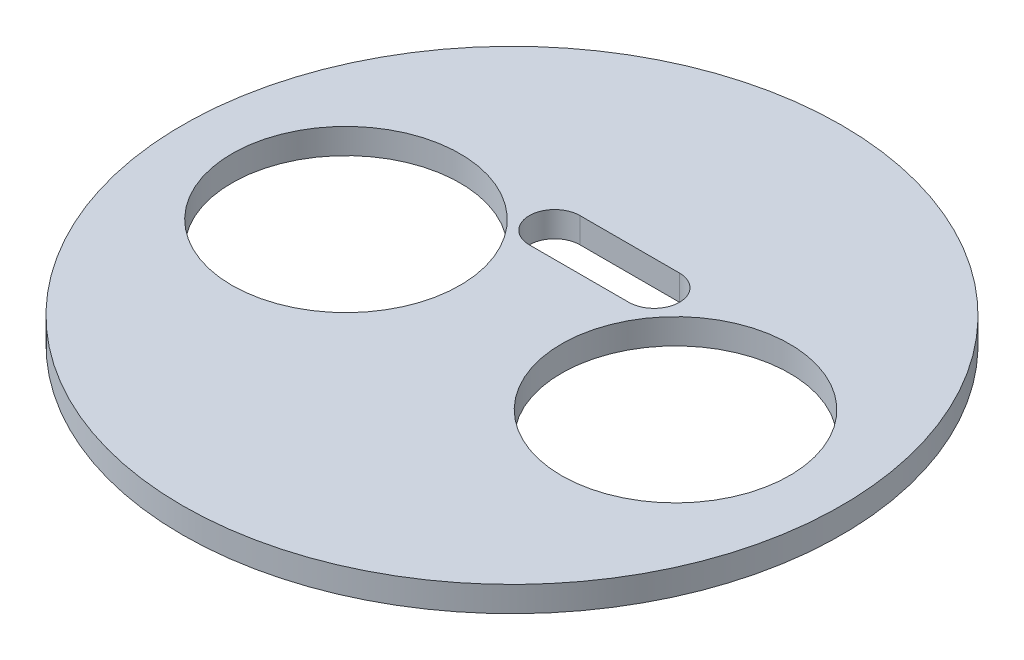
ISO-10303-21;
HEADER;
FILE_DESCRIPTION(('STEP AP214'),'2;1');
FILE_NAME('part.step','',(''),(''),'','','');
FILE_SCHEMA(('AUTOMOTIVE_DESIGN { 1 0 10303 214 1 1 1 1 }'));
ENDSEC;
DATA;
#1=APPLICATION_CONTEXT('core data for automotive mechanical design processes');
#2=APPLICATION_PROTOCOL_DEFINITION('international standard','automotive_design',2000,#1);
#3=PRODUCT_CONTEXT('',#1,'mechanical');
#4=PRODUCT('Part','Part','',(#3));
#5=PRODUCT_RELATED_PRODUCT_CATEGORY('part','',(#4));
#6=PRODUCT_DEFINITION_FORMATION('','',#4);
#7=PRODUCT_DEFINITION_CONTEXT('part definition',#1,'design');
#8=PRODUCT_DEFINITION('design','',#6,#7);
#9=PRODUCT_DEFINITION_SHAPE('','',#8);
#10=(LENGTH_UNIT() NAMED_UNIT(*) SI_UNIT(.MILLI.,.METRE.));
#11=(NAMED_UNIT(*) PLANE_ANGLE_UNIT() SI_UNIT($,.RADIAN.));
#12=(NAMED_UNIT(*) SI_UNIT($,.STERADIAN.) SOLID_ANGLE_UNIT());
#13=UNCERTAINTY_MEASURE_WITH_UNIT(LENGTH_MEASURE(1.E-05),#10,'distance_accuracy_value','');
#14=(GEOMETRIC_REPRESENTATION_CONTEXT(3) GLOBAL_UNCERTAINTY_ASSIGNED_CONTEXT((#13)) GLOBAL_UNIT_ASSIGNED_CONTEXT((#10,
#11,#12)) REPRESENTATION_CONTEXT('',''));
#15=CARTESIAN_POINT('',(0.,0.,0.));
#16=DIRECTION('',(0.,0.,1.));
#17=DIRECTION('',(1.,0.,0.));
#18=AXIS2_PLACEMENT_3D('',#15,#16,#17);
#19=CARTESIAN_POINT('',(3.37106083902436,2.,-8.31125845977741));
#20=DIRECTION('',(0.,-1.,0.));
#21=DIRECTION('',(0.,0.,-1.));
#22=AXIS2_PLACEMENT_3D('',#19,#20,#21);
#23=CYLINDRICAL_SURFACE('',#22,2.);
#24=CARTESIAN_POINT('',(3.37106083902436,0.,-8.31125845977741));
#25=DIRECTION('',(0.,1.,0.));
#26=DIRECTION('',(0.,0.,1.));
#27=AXIS2_PLACEMENT_3D('',#24,#25,#26);
#28=CIRCLE('',#27,2.);
#29=CARTESIAN_POINT('',(3.37106083902436,0.,-6.3112584597774));
#30=VERTEX_POINT('',#29);
#31=CARTESIAN_POINT('',(3.37106083902436,0.,-10.3112584597774));
#32=VERTEX_POINT('',#31);
#33=EDGE_CURVE('E127',#30,#32,#28,.T.);
#34=ORIENTED_EDGE('',*,*,#33,.F.);
#35=DIRECTION('',(0.,-1.,0.));
#36=VECTOR('',#35,1.);
#37=CARTESIAN_POINT('',(3.37106083902436,2.,-6.3112584597774));
#38=LINE('',#37,#36);
#39=CARTESIAN_POINT('',(3.37106083902436,2.,-6.3112584597774));
#40=VERTEX_POINT('',#39);
#41=EDGE_CURVE('E11',#40,#30,#38,.T.);
#42=ORIENTED_EDGE('',*,*,#41,.F.);
#43=CARTESIAN_POINT('',(3.37106083902436,2.,-8.31125845977741));
#44=DIRECTION('',(0.,1.,0.));
#45=DIRECTION('',(0.,0.,1.));
#46=AXIS2_PLACEMENT_3D('',#43,#44,#45);
#47=CIRCLE('',#46,2.);
#48=CARTESIAN_POINT('',(3.37106083902436,2.,-10.3112584597774));
#49=VERTEX_POINT('',#48);
#50=EDGE_CURVE('E105',#40,#49,#47,.T.);
#51=ORIENTED_EDGE('',*,*,#50,.T.);
#52=DIRECTION('',(0.,-1.,0.));
#53=VECTOR('',#52,1.);
#54=CARTESIAN_POINT('',(3.37106083902436,2.,-10.3112584597774));
#55=LINE('',#54,#53);
#56=EDGE_CURVE('E85',#49,#32,#55,.T.);
#57=ORIENTED_EDGE('',*,*,#56,.T.);
#58=EDGE_LOOP('',(#34,#42,#51,#57));
#59=FACE_BOUND('',#58,.T.);
#60=ADVANCED_FACE('F46',(#59),#23,.F.);
#61=CARTESIAN_POINT('',(0.,2.,-6.3112584597774));
#62=DIRECTION('',(0.,0.,-1.));
#63=DIRECTION('',(-1.,0.,0.));
#64=AXIS2_PLACEMENT_3D('',#61,#62,#63);
#65=PLANE('',#64);
#66=DIRECTION('',(1.,0.,0.));
#67=VECTOR('',#66,1.);
#68=CARTESIAN_POINT('',(0.,0.,-6.3112584597774));
#69=LINE('',#68,#67);
#70=CARTESIAN_POINT('',(-4.47967193324449,0.,-6.3112584597774));
#71=VERTEX_POINT('',#70);
#72=EDGE_CURVE('E96',#71,#30,#69,.T.);
#73=ORIENTED_EDGE('',*,*,#72,.F.);
#74=DIRECTION('',(0.,-1.,0.));
#75=VECTOR('',#74,1.);
#76=CARTESIAN_POINT('',(-4.47967193324449,2.,-6.3112584597774));
#77=LINE('',#76,#75);
#78=CARTESIAN_POINT('',(-4.47967193324449,2.,-6.3112584597774));
#79=VERTEX_POINT('',#78);
#80=EDGE_CURVE('E55',#79,#71,#77,.T.);
#81=ORIENTED_EDGE('',*,*,#80,.F.);
#82=DIRECTION('',(1.,0.,0.));
#83=VECTOR('',#82,1.);
#84=CARTESIAN_POINT('',(0.,2.,-6.3112584597774));
#85=LINE('',#84,#83);
#86=EDGE_CURVE('E94',#79,#40,#85,.T.);
#87=ORIENTED_EDGE('',*,*,#86,.T.);
#88=ORIENTED_EDGE('',*,*,#41,.T.);
#89=EDGE_LOOP('',(#73,#81,#87,#88));
#90=FACE_BOUND('',#89,.T.);
#91=ADVANCED_FACE('F93',(#90),#65,.T.);
#92=CARTESIAN_POINT('',(-4.47967193324449,2.,-8.31125845977741));
#93=DIRECTION('',(0.,-1.,0.));
#94=DIRECTION('',(0.,0.,-1.));
#95=AXIS2_PLACEMENT_3D('',#92,#93,#94);
#96=CYLINDRICAL_SURFACE('',#95,2.);
#97=CARTESIAN_POINT('',(-4.47967193324449,0.,-8.31125845977741));
#98=DIRECTION('',(0.,1.,0.));
#99=DIRECTION('',(0.,0.,1.));
#100=AXIS2_PLACEMENT_3D('',#97,#98,#99);
#101=CIRCLE('',#100,2.);
#102=CARTESIAN_POINT('',(-4.47967193324449,0.,-10.3112584597774));
#103=VERTEX_POINT('',#102);
#104=EDGE_CURVE('E133',#103,#71,#101,.T.);
#105=ORIENTED_EDGE('',*,*,#104,.F.);
#106=DIRECTION('',(0.,-1.,0.));
#107=VECTOR('',#106,1.);
#108=CARTESIAN_POINT('',(-4.47967193324449,2.,-10.3112584597774));
#109=LINE('',#108,#107);
#110=CARTESIAN_POINT('',(-4.47967193324449,2.,-10.3112584597774));
#111=VERTEX_POINT('',#110);
#112=EDGE_CURVE('E78',#111,#103,#109,.T.);
#113=ORIENTED_EDGE('',*,*,#112,.F.);
#114=CARTESIAN_POINT('',(-4.47967193324449,2.,-8.31125845977741));
#115=DIRECTION('',(0.,1.,0.));
#116=DIRECTION('',(0.,0.,1.));
#117=AXIS2_PLACEMENT_3D('',#114,#115,#116);
#118=CIRCLE('',#117,2.);
#119=EDGE_CURVE('E104',#111,#79,#118,.T.);
#120=ORIENTED_EDGE('',*,*,#119,.T.);
#121=ORIENTED_EDGE('',*,*,#80,.T.);
#122=EDGE_LOOP('',(#105,#113,#120,#121));
#123=FACE_BOUND('',#122,.T.);
#124=ADVANCED_FACE('F108',(#123),#96,.F.);
#125=CARTESIAN_POINT('',(12.5571906087166,2.,-0.811258459777406));
#126=DIRECTION('',(0.,-1.,0.));
#127=DIRECTION('',(0.,0.,-1.));
#128=AXIS2_PLACEMENT_3D('',#125,#126,#127);
#129=CYLINDRICAL_SURFACE('',#128,9.);
#130=CARTESIAN_POINT('',(12.5571906087166,2.,-0.811258459777406));
#131=DIRECTION('',(0.,1.,0.));
#132=DIRECTION('',(0.,0.,1.));
#133=AXIS2_PLACEMENT_3D('',#130,#131,#132);
#134=CIRCLE('',#133,9.);
#135=CARTESIAN_POINT('',(12.5571906087166,2.,8.18874154022259));
#136=VERTEX_POINT('',#135);
#137=EDGE_CURVE('E119',#136,#136,#134,.T.);
#138=ORIENTED_EDGE('',*,*,#137,.T.);
#139=EDGE_LOOP('',(#138));
#140=FACE_BOUND('',#139,.T.);
#141=CARTESIAN_POINT('',(12.5571906087166,0.,-0.811258459777406));
#142=DIRECTION('',(0.,1.,0.));
#143=DIRECTION('',(0.,0.,1.));
#144=AXIS2_PLACEMENT_3D('',#141,#142,#143);
#145=CIRCLE('',#144,9.);
#146=CARTESIAN_POINT('',(12.5571906087166,0.,8.18874154022259));
#147=VERTEX_POINT('',#146);
#148=EDGE_CURVE('E143',#147,#147,#145,.T.);
#149=ORIENTED_EDGE('',*,*,#148,.F.);
#150=EDGE_LOOP('',(#149));
#151=FACE_BOUND('',#150,.T.);
#152=ADVANCED_FACE('F164',(#140,#151),#129,.F.);
#153=CARTESIAN_POINT('',(-13.4428093912834,2.,-0.811258459777406));
#154=DIRECTION('',(0.,-1.,0.));
#155=DIRECTION('',(0.,0.,-1.));
#156=AXIS2_PLACEMENT_3D('',#153,#154,#155);
#157=CYLINDRICAL_SURFACE('',#156,9.);
#158=CARTESIAN_POINT('',(-13.4428093912834,2.,-0.811258459777406));
#159=DIRECTION('',(0.,1.,0.));
#160=DIRECTION('',(0.,0.,1.));
#161=AXIS2_PLACEMENT_3D('',#158,#159,#160);
#162=CIRCLE('',#161,9.);
#163=CARTESIAN_POINT('',(-13.4428093912834,2.,8.18874154022259));
#164=VERTEX_POINT('',#163);
#165=EDGE_CURVE('E112',#164,#164,#162,.T.);
#166=ORIENTED_EDGE('',*,*,#165,.T.);
#167=EDGE_LOOP('',(#166));
#168=FACE_BOUND('',#167,.T.);
#169=CARTESIAN_POINT('',(-13.4428093912834,0.,-0.811258459777406));
#170=DIRECTION('',(0.,1.,0.));
#171=DIRECTION('',(0.,0.,1.));
#172=AXIS2_PLACEMENT_3D('',#169,#170,#171);
#173=CIRCLE('',#172,9.);
#174=CARTESIAN_POINT('',(-13.4428093912834,0.,8.18874154022259));
#175=VERTEX_POINT('',#174);
#176=EDGE_CURVE('E139',#175,#175,#173,.T.);
#177=ORIENTED_EDGE('',*,*,#176,.F.);
#178=EDGE_LOOP('',(#177));
#179=FACE_BOUND('',#178,.T.);
#180=ADVANCED_FACE('F171',(#168,#179),#157,.F.);
#181=CARTESIAN_POINT('',(0.,2.,-10.3112584597774));
#182=DIRECTION('',(0.,0.,-1.));
#183=DIRECTION('',(-1.,0.,0.));
#184=AXIS2_PLACEMENT_3D('',#181,#182,#183);
#185=PLANE('',#184);
#186=DIRECTION('',(1.,0.,0.));
#187=VECTOR('',#186,1.);
#188=CARTESIAN_POINT('',(0.,0.,-10.3112584597774));
#189=LINE('',#188,#187);
#190=EDGE_CURVE('E136',#103,#32,#189,.T.);
#191=ORIENTED_EDGE('',*,*,#190,.T.);
#192=ORIENTED_EDGE('',*,*,#56,.F.);
#193=DIRECTION('',(1.,0.,0.));
#194=VECTOR('',#193,1.);
#195=CARTESIAN_POINT('',(0.,2.,-10.3112584597774));
#196=LINE('',#195,#194);
#197=EDGE_CURVE('E63',#111,#49,#196,.T.);
#198=ORIENTED_EDGE('',*,*,#197,.F.);
#199=ORIENTED_EDGE('',*,*,#112,.T.);
#200=EDGE_LOOP('',(#191,#192,#198,#199));
#201=FACE_BOUND('',#200,.T.);
#202=ADVANCED_FACE('F167',(#201),#185,.F.);
#203=CARTESIAN_POINT('',(-0.34440532116891,2.,-0.811258459777406));
#204=DIRECTION('',(0.,-1.,0.));
#205=DIRECTION('',(0.,0.,-1.));
#206=AXIS2_PLACEMENT_3D('',#203,#204,#205);
#207=CYLINDRICAL_SURFACE('',#206,26.);
#208=CARTESIAN_POINT('',(-0.34440532116891,2.,-0.811258459777406));
#209=DIRECTION('',(0.,1.,0.));
#210=DIRECTION('',(0.,0.,1.));
#211=AXIS2_PLACEMENT_3D('',#208,#209,#210);
#212=CIRCLE('',#211,26.);
#213=CARTESIAN_POINT('',(-0.34440532116891,2.,25.1887415402226));
#214=VERTEX_POINT('',#213);
#215=EDGE_CURVE('E123',#214,#214,#212,.T.);
#216=ORIENTED_EDGE('',*,*,#215,.F.);
#217=EDGE_LOOP('',(#216));
#218=FACE_BOUND('',#217,.T.);
#219=CARTESIAN_POINT('',(-0.34440532116891,0.,-0.811258459777406));
#220=DIRECTION('',(0.,1.,0.));
#221=DIRECTION('',(0.,0.,1.));
#222=AXIS2_PLACEMENT_3D('',#219,#220,#221);
#223=CIRCLE('',#222,26.);
#224=CARTESIAN_POINT('',(-0.34440532116891,0.,25.1887415402226));
#225=VERTEX_POINT('',#224);
#226=EDGE_CURVE('E147',#225,#225,#223,.T.);
#227=ORIENTED_EDGE('',*,*,#226,.T.);
#228=EDGE_LOOP('',(#227));
#229=FACE_BOUND('',#228,.T.);
#230=ADVANCED_FACE('F170',(#218,#229),#207,.T.);
#231=CARTESIAN_POINT('',(0.,2.,0.));
#232=DIRECTION('',(0.,1.,0.));
#233=DIRECTION('',(0.,0.,1.));
#234=AXIS2_PLACEMENT_3D('',#231,#232,#233);
#235=PLANE('',#234);
#236=ORIENTED_EDGE('',*,*,#50,.F.);
#237=ORIENTED_EDGE('',*,*,#86,.F.);
#238=ORIENTED_EDGE('',*,*,#119,.F.);
#239=ORIENTED_EDGE('',*,*,#197,.T.);
#240=EDGE_LOOP('',(#236,#237,#238,#239));
#241=FACE_BOUND('',#240,.T.);
#242=ORIENTED_EDGE('',*,*,#165,.F.);
#243=EDGE_LOOP('',(#242));
#244=FACE_BOUND('',#243,.T.);
#245=ORIENTED_EDGE('',*,*,#137,.F.);
#246=EDGE_LOOP('',(#245));
#247=FACE_BOUND('',#246,.T.);
#248=ORIENTED_EDGE('',*,*,#215,.T.);
#249=EDGE_LOOP('',(#248));
#250=FACE_BOUND('',#249,.T.);
#251=ADVANCED_FACE('F102',(#241,#244,#247,#250),#235,.T.);
#252=CARTESIAN_POINT('',(0.,0.,0.));
#253=DIRECTION('',(0.,1.,0.));
#254=DIRECTION('',(0.,0.,1.));
#255=AXIS2_PLACEMENT_3D('',#252,#253,#254);
#256=PLANE('',#255);
#257=ORIENTED_EDGE('',*,*,#33,.T.);
#258=ORIENTED_EDGE('',*,*,#190,.F.);
#259=ORIENTED_EDGE('',*,*,#104,.T.);
#260=ORIENTED_EDGE('',*,*,#72,.T.);
#261=EDGE_LOOP('',(#257,#258,#259,#260));
#262=FACE_BOUND('',#261,.T.);
#263=ORIENTED_EDGE('',*,*,#176,.T.);
#264=EDGE_LOOP('',(#263));
#265=FACE_BOUND('',#264,.T.);
#266=ORIENTED_EDGE('',*,*,#148,.T.);
#267=EDGE_LOOP('',(#266));
#268=FACE_BOUND('',#267,.T.);
#269=ORIENTED_EDGE('',*,*,#226,.F.);
#270=EDGE_LOOP('',(#269));
#271=FACE_BOUND('',#270,.T.);
#272=ADVANCED_FACE('F181',(#262,#265,#268,#271),#256,.F.);
#273=CLOSED_SHELL('',(#60,#91,#124,#152,#180,#202,#230,#251,#272));
#274=MANIFOLD_SOLID_BREP('B2',#273);
#275=ADVANCED_BREP_SHAPE_REPRESENTATION('',(#18,#274),#14);
#276=SHAPE_DEFINITION_REPRESENTATION(#9,#275);
ENDSEC;
END-ISO-10303-21;
